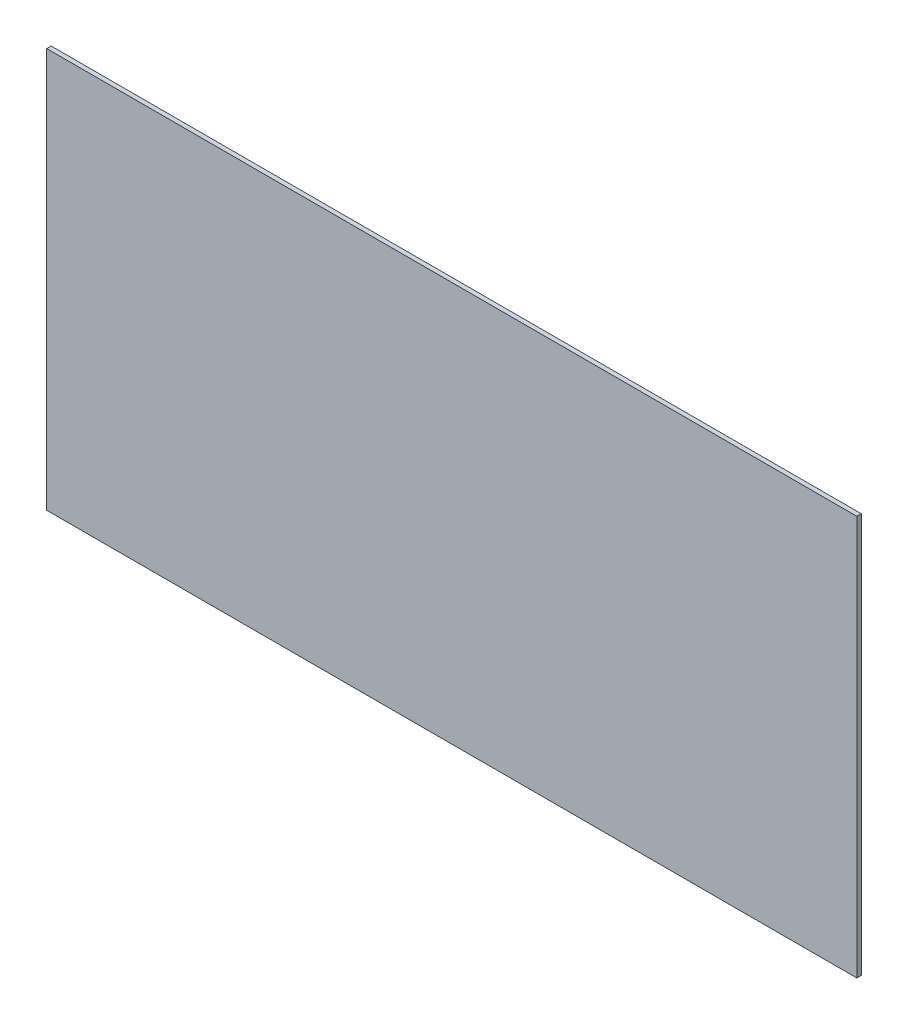
ISO-10303-21;
HEADER;
FILE_DESCRIPTION(('STEP AP214'),'2;1');
FILE_NAME('part.step','',(''),(''),'','','');
FILE_SCHEMA(('AUTOMOTIVE_DESIGN { 1 0 10303 214 1 1 1 1 }'));
ENDSEC;
DATA;
#1=APPLICATION_CONTEXT('core data for automotive mechanical design processes');
#2=APPLICATION_PROTOCOL_DEFINITION('international standard','automotive_design',2000,#1);
#3=PRODUCT_CONTEXT('',#1,'mechanical');
#4=PRODUCT('Part','Part','',(#3));
#5=PRODUCT_RELATED_PRODUCT_CATEGORY('part','',(#4));
#6=PRODUCT_DEFINITION_FORMATION('','',#4);
#7=PRODUCT_DEFINITION_CONTEXT('part definition',#1,'design');
#8=PRODUCT_DEFINITION('design','',#6,#7);
#9=PRODUCT_DEFINITION_SHAPE('','',#8);
#10=(LENGTH_UNIT() NAMED_UNIT(*) SI_UNIT(.MILLI.,.METRE.));
#11=(NAMED_UNIT(*) PLANE_ANGLE_UNIT() SI_UNIT($,.RADIAN.));
#12=(NAMED_UNIT(*) SI_UNIT($,.STERADIAN.) SOLID_ANGLE_UNIT());
#13=UNCERTAINTY_MEASURE_WITH_UNIT(LENGTH_MEASURE(1.E-05),#10,'distance_accuracy_value','');
#14=(GEOMETRIC_REPRESENTATION_CONTEXT(3) GLOBAL_UNCERTAINTY_ASSIGNED_CONTEXT((#13)) GLOBAL_UNIT_ASSIGNED_CONTEXT((#10,
#11,#12)) REPRESENTATION_CONTEXT('',''));
#15=CARTESIAN_POINT('',(0.,0.,0.));
#16=DIRECTION('',(0.,0.,1.));
#17=DIRECTION('',(1.,0.,0.));
#18=AXIS2_PLACEMENT_3D('',#15,#16,#17);
#19=CARTESIAN_POINT('',(273.5,-135.,3.));
#20=DIRECTION('',(-1.,0.,0.));
#21=DIRECTION('',(0.,0.,1.));
#22=AXIS2_PLACEMENT_3D('',#19,#20,#21);
#23=PLANE('',#22);
#24=DIRECTION('',(0.,1.,0.));
#25=VECTOR('',#24,1.);
#26=CARTESIAN_POINT('',(273.5,-135.,0.));
#27=LINE('',#26,#25);
#28=CARTESIAN_POINT('',(273.5,-135.,0.));
#29=VERTEX_POINT('',#28);
#30=CARTESIAN_POINT('',(273.5,135.,0.));
#31=VERTEX_POINT('',#30);
#32=EDGE_CURVE('E96',#29,#31,#27,.T.);
#33=ORIENTED_EDGE('',*,*,#32,.T.);
#34=DIRECTION('',(0.,0.,-1.));
#35=VECTOR('',#34,1.);
#36=CARTESIAN_POINT('',(273.5,135.,3.));
#37=LINE('',#36,#35);
#38=CARTESIAN_POINT('',(273.5,135.,3.));
#39=VERTEX_POINT('',#38);
#40=EDGE_CURVE('E11',#39,#31,#37,.T.);
#41=ORIENTED_EDGE('',*,*,#40,.F.);
#42=DIRECTION('',(0.,1.,0.));
#43=VECTOR('',#42,1.);
#44=CARTESIAN_POINT('',(273.5,-135.,3.));
#45=LINE('',#44,#43);
#46=CARTESIAN_POINT('',(273.5,-135.,3.));
#47=VERTEX_POINT('',#46);
#48=EDGE_CURVE('E84',#47,#39,#45,.T.);
#49=ORIENTED_EDGE('',*,*,#48,.F.);
#50=DIRECTION('',(0.,0.,-1.));
#51=VECTOR('',#50,1.);
#52=CARTESIAN_POINT('',(273.5,-135.,3.));
#53=LINE('',#52,#51);
#54=EDGE_CURVE('E92',#47,#29,#53,.T.);
#55=ORIENTED_EDGE('',*,*,#54,.T.);
#56=EDGE_LOOP('',(#33,#41,#49,#55));
#57=FACE_BOUND('',#56,.T.);
#58=ADVANCED_FACE('F33',(#57),#23,.F.);
#59=CARTESIAN_POINT('',(-273.5,135.,3.));
#60=DIRECTION('',(0.,-1.,0.));
#61=DIRECTION('',(0.,0.,-1.));
#62=AXIS2_PLACEMENT_3D('',#59,#60,#61);
#63=PLANE('',#62);
#64=DIRECTION('',(-1.,0.,0.));
#65=VECTOR('',#64,1.);
#66=CARTESIAN_POINT('',(-273.5,135.,0.));
#67=LINE('',#66,#65);
#68=CARTESIAN_POINT('',(-273.5,135.,0.));
#69=VERTEX_POINT('',#68);
#70=EDGE_CURVE('E88',#31,#69,#67,.T.);
#71=ORIENTED_EDGE('',*,*,#70,.T.);
#72=DIRECTION('',(0.,0.,-1.));
#73=VECTOR('',#72,1.);
#74=CARTESIAN_POINT('',(-273.5,135.,3.));
#75=LINE('',#74,#73);
#76=CARTESIAN_POINT('',(-273.5,135.,3.));
#77=VERTEX_POINT('',#76);
#78=EDGE_CURVE('E41',#77,#69,#75,.T.);
#79=ORIENTED_EDGE('',*,*,#78,.F.);
#80=DIRECTION('',(-1.,0.,0.));
#81=VECTOR('',#80,1.);
#82=CARTESIAN_POINT('',(-273.5,135.,3.));
#83=LINE('',#82,#81);
#84=EDGE_CURVE('E79',#39,#77,#83,.T.);
#85=ORIENTED_EDGE('',*,*,#84,.F.);
#86=ORIENTED_EDGE('',*,*,#40,.T.);
#87=EDGE_LOOP('',(#71,#79,#85,#86));
#88=FACE_BOUND('',#87,.T.);
#89=ADVANCED_FACE('F87',(#88),#63,.F.);
#90=CARTESIAN_POINT('',(-273.5,-135.,3.));
#91=DIRECTION('',(1.,0.,0.));
#92=DIRECTION('',(0.,0.,-1.));
#93=AXIS2_PLACEMENT_3D('',#90,#91,#92);
#94=PLANE('',#93);
#95=DIRECTION('',(0.,-1.,0.));
#96=VECTOR('',#95,1.);
#97=CARTESIAN_POINT('',(-273.5,-135.,0.));
#98=LINE('',#97,#96);
#99=CARTESIAN_POINT('',(-273.5,-135.,0.));
#100=VERTEX_POINT('',#99);
#101=EDGE_CURVE('E66',#69,#100,#98,.T.);
#102=ORIENTED_EDGE('',*,*,#101,.T.);
#103=DIRECTION('',(0.,0.,-1.));
#104=VECTOR('',#103,1.);
#105=CARTESIAN_POINT('',(-273.5,-135.,3.));
#106=LINE('',#105,#104);
#107=CARTESIAN_POINT('',(-273.5,-135.,3.));
#108=VERTEX_POINT('',#107);
#109=EDGE_CURVE('E89',#108,#100,#106,.T.);
#110=ORIENTED_EDGE('',*,*,#109,.F.);
#111=DIRECTION('',(0.,-1.,0.));
#112=VECTOR('',#111,1.);
#113=CARTESIAN_POINT('',(-273.5,-135.,3.));
#114=LINE('',#113,#112);
#115=EDGE_CURVE('E82',#77,#108,#114,.T.);
#116=ORIENTED_EDGE('',*,*,#115,.F.);
#117=ORIENTED_EDGE('',*,*,#78,.T.);
#118=EDGE_LOOP('',(#102,#110,#116,#117));
#119=FACE_BOUND('',#118,.T.);
#120=ADVANCED_FACE('F90',(#119),#94,.F.);
#121=CARTESIAN_POINT('',(-273.5,-135.,3.));
#122=DIRECTION('',(0.,1.,0.));
#123=DIRECTION('',(0.,0.,1.));
#124=AXIS2_PLACEMENT_3D('',#121,#122,#123);
#125=PLANE('',#124);
#126=DIRECTION('',(1.,0.,0.));
#127=VECTOR('',#126,1.);
#128=CARTESIAN_POINT('',(-273.5,-135.,0.));
#129=LINE('',#128,#127);
#130=EDGE_CURVE('E72',#100,#29,#129,.T.);
#131=ORIENTED_EDGE('',*,*,#130,.T.);
#132=ORIENTED_EDGE('',*,*,#54,.F.);
#133=DIRECTION('',(1.,0.,0.));
#134=VECTOR('',#133,1.);
#135=CARTESIAN_POINT('',(-273.5,-135.,3.));
#136=LINE('',#135,#134);
#137=EDGE_CURVE('E49',#108,#47,#136,.T.);
#138=ORIENTED_EDGE('',*,*,#137,.F.);
#139=ORIENTED_EDGE('',*,*,#109,.T.);
#140=EDGE_LOOP('',(#131,#132,#138,#139));
#141=FACE_BOUND('',#140,.T.);
#142=ADVANCED_FACE('F103',(#141),#125,.F.);
#143=CARTESIAN_POINT('',(0.,0.,3.));
#144=DIRECTION('',(0.,0.,-1.));
#145=DIRECTION('',(-1.,0.,0.));
#146=AXIS2_PLACEMENT_3D('',#143,#144,#145);
#147=PLANE('',#146);
#148=ORIENTED_EDGE('',*,*,#48,.T.);
#149=ORIENTED_EDGE('',*,*,#84,.T.);
#150=ORIENTED_EDGE('',*,*,#115,.T.);
#151=ORIENTED_EDGE('',*,*,#137,.T.);
#152=EDGE_LOOP('',(#148,#149,#150,#151));
#153=FACE_BOUND('',#152,.T.);
#154=ADVANCED_FACE('F80',(#153),#147,.F.);
#155=CARTESIAN_POINT('',(0.,0.,0.));
#156=DIRECTION('',(0.,0.,-1.));
#157=DIRECTION('',(-1.,0.,0.));
#158=AXIS2_PLACEMENT_3D('',#155,#156,#157);
#159=PLANE('',#158);
#160=ORIENTED_EDGE('',*,*,#32,.F.);
#161=ORIENTED_EDGE('',*,*,#130,.F.);
#162=ORIENTED_EDGE('',*,*,#101,.F.);
#163=ORIENTED_EDGE('',*,*,#70,.F.);
#164=EDGE_LOOP('',(#160,#161,#162,#163));
#165=FACE_BOUND('',#164,.T.);
#166=ADVANCED_FACE('F106',(#165),#159,.T.);
#167=CLOSED_SHELL('',(#58,#89,#120,#142,#154,#166));
#168=MANIFOLD_SOLID_BREP('B2',#167);
#169=ADVANCED_BREP_SHAPE_REPRESENTATION('',(#18,#168),#14);
#170=SHAPE_DEFINITION_REPRESENTATION(#9,#169);
ENDSEC;
END-ISO-10303-21;
